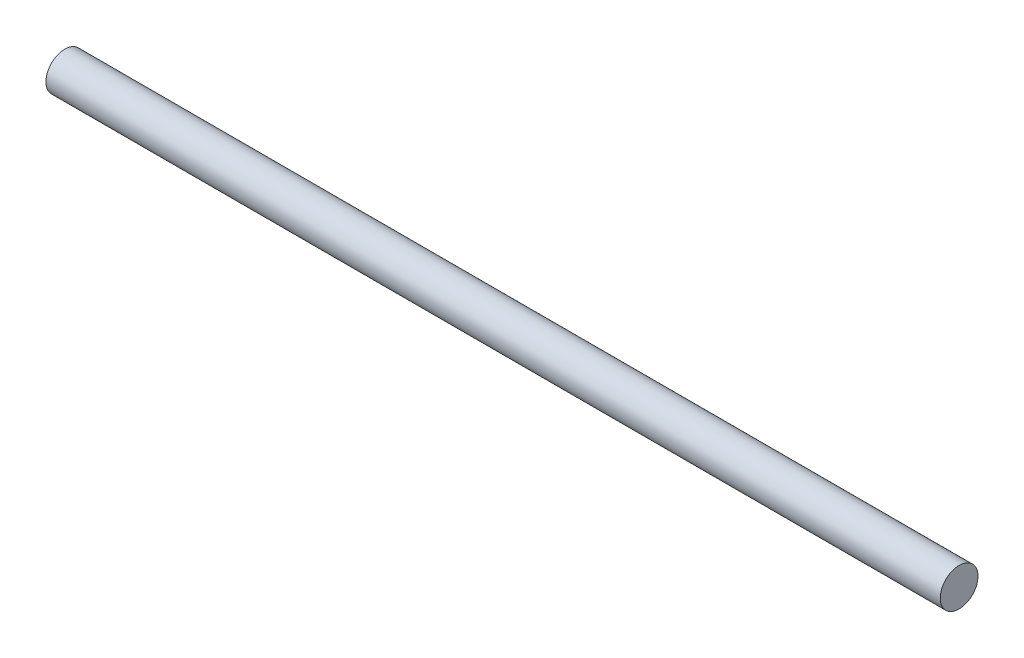
ISO-10303-21;
HEADER;
FILE_DESCRIPTION(('STEP AP214'),'2;1');
FILE_NAME('part.step','',(''),(''),'','','');
FILE_SCHEMA(('AUTOMOTIVE_DESIGN { 1 0 10303 214 1 1 1 1 }'));
ENDSEC;
DATA;
#1=APPLICATION_CONTEXT('core data for automotive mechanical design processes');
#2=APPLICATION_PROTOCOL_DEFINITION('international standard','automotive_design',2000,#1);
#3=PRODUCT_CONTEXT('',#1,'mechanical');
#4=PRODUCT('Part','Part','',(#3));
#5=PRODUCT_RELATED_PRODUCT_CATEGORY('part','',(#4));
#6=PRODUCT_DEFINITION_FORMATION('','',#4);
#7=PRODUCT_DEFINITION_CONTEXT('part definition',#1,'design');
#8=PRODUCT_DEFINITION('design','',#6,#7);
#9=PRODUCT_DEFINITION_SHAPE('','',#8);
#10=(LENGTH_UNIT() NAMED_UNIT(*) SI_UNIT(.MILLI.,.METRE.));
#11=(NAMED_UNIT(*) PLANE_ANGLE_UNIT() SI_UNIT($,.RADIAN.));
#12=(NAMED_UNIT(*) SI_UNIT($,.STERADIAN.) SOLID_ANGLE_UNIT());
#13=UNCERTAINTY_MEASURE_WITH_UNIT(LENGTH_MEASURE(1.E-05),#10,'distance_accuracy_value','');
#14=(GEOMETRIC_REPRESENTATION_CONTEXT(3) GLOBAL_UNCERTAINTY_ASSIGNED_CONTEXT((#13)) GLOBAL_UNIT_ASSIGNED_CONTEXT((#10,
#11,#12)) REPRESENTATION_CONTEXT('',''));
#15=CARTESIAN_POINT('',(0.,0.,0.));
#16=DIRECTION('',(0.,0.,1.));
#17=DIRECTION('',(1.,0.,0.));
#18=AXIS2_PLACEMENT_3D('',#15,#16,#17);
#19=CARTESIAN_POINT('',(71.,0.,0.));
#20=DIRECTION('',(-1.,0.,0.));
#21=DIRECTION('',(0.,0.,1.));
#22=AXIS2_PLACEMENT_3D('',#19,#20,#21);
#23=CYLINDRICAL_SURFACE('',#22,1.5);
#24=CARTESIAN_POINT('',(71.,0.,0.));
#25=DIRECTION('',(1.,0.,0.));
#26=DIRECTION('',(0.,0.,-1.));
#27=AXIS2_PLACEMENT_3D('',#24,#25,#26);
#28=CIRCLE('',#27,1.5);
#29=CARTESIAN_POINT('',(71.,0.,-1.5));
#30=VERTEX_POINT('',#29);
#31=EDGE_CURVE('E10',#30,#30,#28,.T.);
#32=ORIENTED_EDGE('',*,*,#31,.F.);
#33=EDGE_LOOP('',(#32));
#34=FACE_BOUND('',#33,.T.);
#35=CARTESIAN_POINT('',(0.,0.,0.));
#36=DIRECTION('',(1.,0.,0.));
#37=DIRECTION('',(0.,0.,-1.));
#38=AXIS2_PLACEMENT_3D('',#35,#36,#37);
#39=CIRCLE('',#38,1.5);
#40=CARTESIAN_POINT('',(0.,0.,-1.5));
#41=VERTEX_POINT('',#40);
#42=EDGE_CURVE('E38',#41,#41,#39,.T.);
#43=ORIENTED_EDGE('',*,*,#42,.T.);
#44=EDGE_LOOP('',(#43));
#45=FACE_BOUND('',#44,.T.);
#46=ADVANCED_FACE('F35',(#34,#45),#23,.T.);
#47=CARTESIAN_POINT('',(71.,0.,0.));
#48=DIRECTION('',(1.,0.,0.));
#49=DIRECTION('',(0.,0.,-1.));
#50=AXIS2_PLACEMENT_3D('',#47,#48,#49);
#51=PLANE('',#50);
#52=ORIENTED_EDGE('',*,*,#31,.T.);
#53=EDGE_LOOP('',(#52));
#54=FACE_BOUND('',#53,.T.);
#55=ADVANCED_FACE('F50',(#54),#51,.T.);
#56=CARTESIAN_POINT('',(0.,0.,0.));
#57=DIRECTION('',(1.,0.,0.));
#58=DIRECTION('',(0.,0.,-1.));
#59=AXIS2_PLACEMENT_3D('',#56,#57,#58);
#60=PLANE('',#59);
#61=ORIENTED_EDGE('',*,*,#42,.F.);
#62=EDGE_LOOP('',(#61));
#63=FACE_BOUND('',#62,.T.);
#64=ADVANCED_FACE('F48',(#63),#60,.F.);
#65=CLOSED_SHELL('',(#46,#55,#64));
#66=MANIFOLD_SOLID_BREP('B2',#65);
#67=ADVANCED_BREP_SHAPE_REPRESENTATION('',(#18,#66),#14);
#68=SHAPE_DEFINITION_REPRESENTATION(#9,#67);
ENDSEC;
END-ISO-10303-21;
